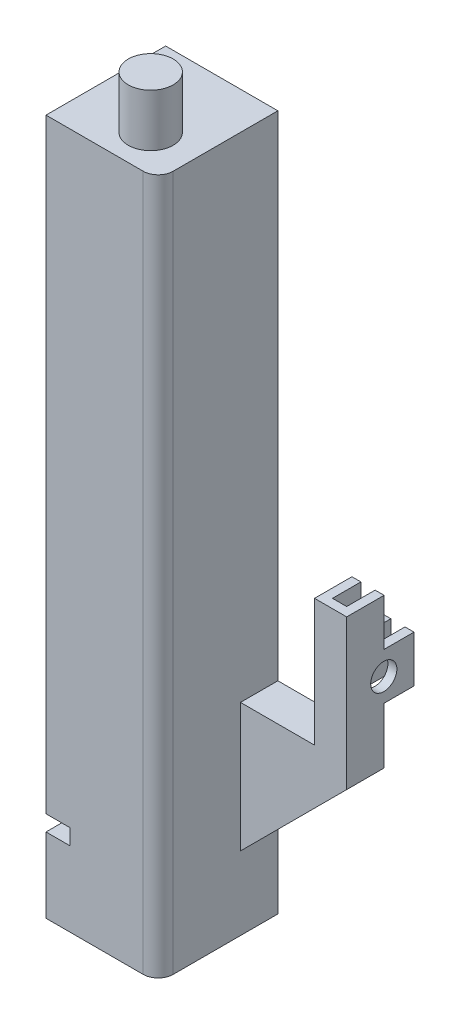
ISO-10303-21;
HEADER;
FILE_DESCRIPTION(('STEP AP214'),'2;1');
FILE_NAME('part.step','',(''),(''),'','','');
FILE_SCHEMA(('AUTOMOTIVE_DESIGN { 1 0 10303 214 1 1 1 1 }'));
ENDSEC;
DATA;
#1=APPLICATION_CONTEXT('core data for automotive mechanical design processes');
#2=APPLICATION_PROTOCOL_DEFINITION('international standard','automotive_design',2000,#1);
#3=PRODUCT_CONTEXT('',#1,'mechanical');
#4=PRODUCT('Part','Part','',(#3));
#5=PRODUCT_RELATED_PRODUCT_CATEGORY('part','',(#4));
#6=PRODUCT_DEFINITION_FORMATION('','',#4);
#7=PRODUCT_DEFINITION_CONTEXT('part definition',#1,'design');
#8=PRODUCT_DEFINITION('design','',#6,#7);
#9=PRODUCT_DEFINITION_SHAPE('','',#8);
#10=(LENGTH_UNIT() NAMED_UNIT(*) SI_UNIT(.MILLI.,.METRE.));
#11=(NAMED_UNIT(*) PLANE_ANGLE_UNIT() SI_UNIT($,.RADIAN.));
#12=(NAMED_UNIT(*) SI_UNIT($,.STERADIAN.) SOLID_ANGLE_UNIT());
#13=UNCERTAINTY_MEASURE_WITH_UNIT(LENGTH_MEASURE(1.E-05),#10,'distance_accuracy_value','');
#14=(GEOMETRIC_REPRESENTATION_CONTEXT(3) GLOBAL_UNCERTAINTY_ASSIGNED_CONTEXT((#13)) GLOBAL_UNIT_ASSIGNED_CONTEXT((#10,
#11,#12)) REPRESENTATION_CONTEXT('',''));
#15=CARTESIAN_POINT('',(0.,0.,0.));
#16=DIRECTION('',(0.,0.,1.));
#17=DIRECTION('',(1.,0.,0.));
#18=AXIS2_PLACEMENT_3D('',#15,#16,#17);
#19=CARTESIAN_POINT('',(-7.5,93.,7.5));
#20=DIRECTION('',(1.,0.,0.));
#21=DIRECTION('',(0.,0.,-1.));
#22=AXIS2_PLACEMENT_3D('',#19,#20,#21);
#23=PLANE('',#22);
#24=DIRECTION('',(0.,1.,0.));
#25=VECTOR('',#24,1.);
#26=CARTESIAN_POINT('',(-7.5,27.,-8.5));
#27=LINE('',#26,#25);
#28=CARTESIAN_POINT('',(-7.5,12.1,-8.5));
#29=VERTEX_POINT('',#28);
#30=CARTESIAN_POINT('',(-7.49999999999999,93.,-8.5));
#31=VERTEX_POINT('',#30);
#32=EDGE_CURVE('E294',#29,#31,#27,.T.);
#33=ORIENTED_EDGE('',*,*,#32,.F.);
#34=DIRECTION('',(0.,0.,1.));
#35=VECTOR('',#34,1.);
#36=CARTESIAN_POINT('',(-7.5,12.1,-12.5));
#37=LINE('',#36,#35);
#38=CARTESIAN_POINT('',(-7.5,12.1,7.5));
#39=VERTEX_POINT('',#38);
#40=EDGE_CURVE('E438',#29,#39,#37,.T.);
#41=ORIENTED_EDGE('',*,*,#40,.T.);
#42=DIRECTION('',(0.,-1.,0.));
#43=VECTOR('',#42,1.);
#44=CARTESIAN_POINT('',(-7.5,93.,7.5));
#45=LINE('',#44,#43);
#46=CARTESIAN_POINT('',(-7.5,93.,7.5));
#47=VERTEX_POINT('',#46);
#48=EDGE_CURVE('E243',#47,#39,#45,.T.);
#49=ORIENTED_EDGE('',*,*,#48,.F.);
#50=DIRECTION('',(0.,0.,1.));
#51=VECTOR('',#50,1.);
#52=CARTESIAN_POINT('',(-7.5,93.,7.5));
#53=LINE('',#52,#51);
#54=EDGE_CURVE('E248',#31,#47,#53,.T.);
#55=ORIENTED_EDGE('',*,*,#54,.F.);
#56=EDGE_LOOP('',(#33,#41,#49,#55));
#57=FACE_BOUND('',#56,.T.);
#58=ADVANCED_FACE('F35',(#57),#23,.F.);
#59=CARTESIAN_POINT('',(0.,27.,-8.5));
#60=DIRECTION('',(0.,-1.,0.));
#61=DIRECTION('',(1.,0.,0.));
#62=AXIS2_PLACEMENT_3D('',#59,#60,#61);
#63=PLANE('',#62);
#64=DIRECTION('',(1.,0.,0.));
#65=VECTOR('',#64,1.);
#66=CARTESIAN_POINT('',(0.,27.,-8.5));
#67=LINE('',#66,#65);
#68=CARTESIAN_POINT('',(7.5,27.,-8.5));
#69=VERTEX_POINT('',#68);
#70=CARTESIAN_POINT('',(17.4,27.,-8.5));
#71=VERTEX_POINT('',#70);
#72=EDGE_CURVE('E377',#69,#71,#67,.T.);
#73=ORIENTED_EDGE('',*,*,#72,.F.);
#74=DIRECTION('',(0.,0.,1.));
#75=VECTOR('',#74,1.);
#76=CARTESIAN_POINT('',(7.5,27.,-8.5));
#77=LINE('',#76,#75);
#78=CARTESIAN_POINT('',(7.5,27.,-3.5));
#79=VERTEX_POINT('',#78);
#80=EDGE_CURVE('E410',#69,#79,#77,.T.);
#81=ORIENTED_EDGE('',*,*,#80,.T.);
#82=DIRECTION('',(1.,0.,0.));
#83=VECTOR('',#82,1.);
#84=CARTESIAN_POINT('',(0.,27.,-3.5));
#85=LINE('',#84,#83);
#86=CARTESIAN_POINT('',(17.4,27.,-3.5));
#87=VERTEX_POINT('',#86);
#88=EDGE_CURVE('E364',#79,#87,#85,.T.);
#89=ORIENTED_EDGE('',*,*,#88,.T.);
#90=DIRECTION('',(0.,0.,1.));
#91=VECTOR('',#90,1.);
#92=CARTESIAN_POINT('',(17.4,27.,-8.5));
#93=LINE('',#92,#91);
#94=EDGE_CURVE('E408',#71,#87,#93,.T.);
#95=ORIENTED_EDGE('',*,*,#94,.F.);
#96=EDGE_LOOP('',(#73,#81,#89,#95));
#97=FACE_BOUND('',#96,.T.);
#98=ADVANCED_FACE('F477',(#97),#63,.F.);
#99=CARTESIAN_POINT('',(0.,0.,-8.5));
#100=DIRECTION('',(0.,0.,-1.));
#101=DIRECTION('',(-1.,0.,0.));
#102=AXIS2_PLACEMENT_3D('',#99,#100,#101);
#103=PLANE('',#102);
#104=DIRECTION('',(0.,-1.,0.));
#105=VECTOR('',#104,1.);
#106=CARTESIAN_POINT('',(20.5000000000001,0.,-8.5));
#107=LINE('',#106,#105);
#108=CARTESIAN_POINT('',(20.5000000000001,44.,-8.5));
#109=VERTEX_POINT('',#108);
#110=CARTESIAN_POINT('',(20.5000000000001,37.74,-8.5));
#111=VERTEX_POINT('',#110);
#112=EDGE_CURVE('E319',#109,#111,#107,.T.);
#113=ORIENTED_EDGE('',*,*,#112,.F.);
#114=DIRECTION('',(-1.,0.,0.));
#115=VECTOR('',#114,1.);
#116=CARTESIAN_POINT('',(0.,44.,-8.5));
#117=LINE('',#116,#115);
#118=CARTESIAN_POINT('',(21.7,44.,-8.5));
#119=VERTEX_POINT('',#118);
#120=EDGE_CURVE('E385',#119,#109,#117,.T.);
#121=ORIENTED_EDGE('',*,*,#120,.F.);
#122=DIRECTION('',(0.,-1.,0.));
#123=VECTOR('',#122,1.);
#124=CARTESIAN_POINT('',(21.7,0.,-8.5));
#125=LINE('',#124,#123);
#126=CARTESIAN_POINT('',(21.7,37.74,-8.5));
#127=VERTEX_POINT('',#126);
#128=EDGE_CURVE('E374',#119,#127,#125,.T.);
#129=ORIENTED_EDGE('',*,*,#128,.T.);
#130=DIRECTION('',(1.,0.,0.));
#131=VECTOR('',#130,1.);
#132=CARTESIAN_POINT('',(0.,37.74,-8.5));
#133=LINE('',#132,#131);
#134=EDGE_CURVE('E268',#111,#127,#133,.T.);
#135=ORIENTED_EDGE('',*,*,#134,.F.);
#136=EDGE_LOOP('',(#113,#121,#129,#135));
#137=FACE_BOUND('',#136,.T.);
#138=ADVANCED_FACE('F524',(#137),#103,.T.);
#139=CARTESIAN_POINT('',(3.07345121810559,31.5,-12.5));
#140=DIRECTION('',(0.,-1.,0.));
#141=DIRECTION('',(0.,0.,-1.));
#142=AXIS2_PLACEMENT_3D('',#139,#140,#141);
#143=PLANE('',#142);
#144=DIRECTION('',(0.,0.,1.));
#145=VECTOR('',#144,1.);
#146=CARTESIAN_POINT('',(20.5000000000001,31.5,-12.5));
#147=LINE('',#146,#145);
#148=CARTESIAN_POINT('',(20.5000000000001,31.5,-12.5));
#149=VERTEX_POINT('',#148);
#150=CARTESIAN_POINT('',(20.5000000000001,31.5,-8.5));
#151=VERTEX_POINT('',#150);
#152=EDGE_CURVE('E317',#149,#151,#147,.T.);
#153=ORIENTED_EDGE('',*,*,#152,.F.);
#154=DIRECTION('',(1.,0.,0.));
#155=VECTOR('',#154,1.);
#156=CARTESIAN_POINT('',(3.07345121810559,31.5,-12.5));
#157=LINE('',#156,#155);
#158=CARTESIAN_POINT('',(21.7,31.5,-12.5));
#159=VERTEX_POINT('',#158);
#160=EDGE_CURVE('E333',#149,#159,#157,.T.);
#161=ORIENTED_EDGE('',*,*,#160,.T.);
#162=DIRECTION('',(0.,0.,-1.));
#163=VECTOR('',#162,1.);
#164=CARTESIAN_POINT('',(21.7,31.5,-12.5));
#165=LINE('',#164,#163);
#166=CARTESIAN_POINT('',(21.7,31.5,-8.5));
#167=VERTEX_POINT('',#166);
#168=EDGE_CURVE('E321',#167,#159,#165,.T.);
#169=ORIENTED_EDGE('',*,*,#168,.F.);
#170=DIRECTION('',(-1.,0.,0.));
#171=VECTOR('',#170,1.);
#172=CARTESIAN_POINT('',(0.,31.5,-8.5));
#173=LINE('',#172,#171);
#174=EDGE_CURVE('E265',#167,#151,#173,.T.);
#175=ORIENTED_EDGE('',*,*,#174,.T.);
#176=EDGE_LOOP('',(#153,#161,#169,#175));
#177=FACE_BOUND('',#176,.T.);
#178=ADVANCED_FACE('F510',(#177),#143,.T.);
#179=CARTESIAN_POINT('',(3.07345121810559,37.74,-12.5));
#180=DIRECTION('',(0.,0.,-1.));
#181=DIRECTION('',(0.,1.,0.));
#182=AXIS2_PLACEMENT_3D('',#179,#180,#181);
#183=PLANE('',#182);
#184=DIRECTION('',(0.,-1.,0.));
#185=VECTOR('',#184,1.);
#186=CARTESIAN_POINT('',(20.5000000000001,37.74,-12.5));
#187=LINE('',#186,#185);
#188=CARTESIAN_POINT('',(20.5000000000001,37.74,-12.5));
#189=VERTEX_POINT('',#188);
#190=EDGE_CURVE('E315',#189,#149,#187,.T.);
#191=ORIENTED_EDGE('',*,*,#190,.F.);
#192=DIRECTION('',(1.,0.,0.));
#193=VECTOR('',#192,1.);
#194=CARTESIAN_POINT('',(3.07345121810559,37.74,-12.5));
#195=LINE('',#194,#193);
#196=CARTESIAN_POINT('',(21.7,37.74,-12.5));
#197=VERTEX_POINT('',#196);
#198=EDGE_CURVE('E342',#189,#197,#195,.T.);
#199=ORIENTED_EDGE('',*,*,#198,.T.);
#200=DIRECTION('',(0.,1.,0.));
#201=VECTOR('',#200,1.);
#202=CARTESIAN_POINT('',(21.7,37.74,-12.5));
#203=LINE('',#202,#201);
#204=EDGE_CURVE('E326',#159,#197,#203,.T.);
#205=ORIENTED_EDGE('',*,*,#204,.F.);
#206=ORIENTED_EDGE('',*,*,#160,.F.);
#207=EDGE_LOOP('',(#191,#199,#205,#206));
#208=FACE_BOUND('',#207,.T.);
#209=ADVANCED_FACE('F516',(#208),#183,.T.);
#210=CARTESIAN_POINT('',(3.07345121810559,37.74,-8.5));
#211=DIRECTION('',(0.,1.,0.));
#212=DIRECTION('',(0.,0.,1.));
#213=AXIS2_PLACEMENT_3D('',#210,#211,#212);
#214=PLANE('',#213);
#215=DIRECTION('',(0.,0.,-1.));
#216=VECTOR('',#215,1.);
#217=CARTESIAN_POINT('',(20.5000000000001,37.74,-8.5));
#218=LINE('',#217,#216);
#219=EDGE_CURVE('E274',#111,#189,#218,.T.);
#220=ORIENTED_EDGE('',*,*,#219,.F.);
#221=ORIENTED_EDGE('',*,*,#134,.T.);
#222=DIRECTION('',(0.,0.,1.));
#223=VECTOR('',#222,1.);
#224=CARTESIAN_POINT('',(21.7,37.74,-8.5));
#225=LINE('',#224,#223);
#226=EDGE_CURVE('E322',#197,#127,#225,.T.);
#227=ORIENTED_EDGE('',*,*,#226,.F.);
#228=ORIENTED_EDGE('',*,*,#198,.F.);
#229=EDGE_LOOP('',(#220,#221,#227,#228));
#230=FACE_BOUND('',#229,.T.);
#231=ADVANCED_FACE('F520',(#230),#214,.T.);
#232=DIRECTION('',(0.,1.,0.));
#233=VECTOR('',#232,1.);
#234=CARTESIAN_POINT('',(18.6000000000001,0.,-8.5));
#235=LINE('',#234,#233);
#236=CARTESIAN_POINT('',(18.6000000000001,37.74,-8.5));
#237=VERTEX_POINT('',#236);
#238=CARTESIAN_POINT('',(18.6000000000001,44.,-8.5));
#239=VERTEX_POINT('',#238);
#240=EDGE_CURVE('E312',#237,#239,#235,.T.);
#241=ORIENTED_EDGE('',*,*,#240,.F.);
#242=CARTESIAN_POINT('',(17.4,37.74,-8.5));
#243=VERTEX_POINT('',#242);
#244=EDGE_CURVE('E269',#243,#237,#133,.T.);
#245=ORIENTED_EDGE('',*,*,#244,.F.);
#246=DIRECTION('',(0.,-1.,0.));
#247=VECTOR('',#246,1.);
#248=CARTESIAN_POINT('',(17.4,0.,-8.5));
#249=LINE('',#248,#247);
#250=CARTESIAN_POINT('',(17.4,44.,-8.5));
#251=VERTEX_POINT('',#250);
#252=EDGE_CURVE('E381',#251,#243,#249,.T.);
#253=ORIENTED_EDGE('',*,*,#252,.F.);
#254=EDGE_CURVE('E384',#239,#251,#117,.T.);
#255=ORIENTED_EDGE('',*,*,#254,.F.);
#256=EDGE_LOOP('',(#241,#245,#253,#255));
#257=FACE_BOUND('',#256,.T.);
#258=ADVANCED_FACE('F495',(#257),#103,.T.);
#259=CARTESIAN_POINT('',(7.5,93.,7.5));
#260=DIRECTION('',(-1.,0.,0.));
#261=DIRECTION('',(0.,0.,1.));
#262=AXIS2_PLACEMENT_3D('',#259,#260,#261);
#263=PLANE('',#262);
#264=DIRECTION('',(0.,0.,1.));
#265=VECTOR('',#264,1.);
#266=CARTESIAN_POINT('',(7.5,9.79999999999985,-28.5818325856981));
#267=LINE('',#266,#265);
#268=CARTESIAN_POINT('',(7.50000000000001,9.79999999999988,-8.5));
#269=VERTEX_POINT('',#268);
#270=CARTESIAN_POINT('',(7.5,9.79999999999985,-3.5));
#271=VERTEX_POINT('',#270);
#272=EDGE_CURVE('E447',#269,#271,#267,.T.);
#273=ORIENTED_EDGE('',*,*,#272,.T.);
#274=DIRECTION('',(0.,-1.,0.));
#275=VECTOR('',#274,1.);
#276=CARTESIAN_POINT('',(7.5,0.,-3.5));
#277=LINE('',#276,#275);
#278=EDGE_CURVE('E50',#79,#271,#277,.T.);
#279=ORIENTED_EDGE('',*,*,#278,.F.);
#280=ORIENTED_EDGE('',*,*,#80,.F.);
#281=DIRECTION('',(0.,-1.,0.));
#282=VECTOR('',#281,1.);
#283=CARTESIAN_POINT('',(7.50000000000001,108.033296378373,-8.5));
#284=LINE('',#283,#282);
#285=CARTESIAN_POINT('',(7.50000000000001,93.,-8.5));
#286=VERTEX_POINT('',#285);
#287=EDGE_CURVE('E300',#286,#69,#284,.T.);
#288=ORIENTED_EDGE('',*,*,#287,.F.);
#289=DIRECTION('',(0.,0.,-1.));
#290=VECTOR('',#289,1.);
#291=CARTESIAN_POINT('',(7.5,93.,7.5));
#292=LINE('',#291,#290);
#293=CARTESIAN_POINT('',(7.5,93.,5.5));
#294=VERTEX_POINT('',#293);
#295=EDGE_CURVE('E419',#294,#286,#292,.T.);
#296=ORIENTED_EDGE('',*,*,#295,.F.);
#297=DIRECTION('',(0.,-1.,0.));
#298=VECTOR('',#297,1.);
#299=CARTESIAN_POINT('',(7.5,93.,5.5));
#300=LINE('',#299,#298);
#301=CARTESIAN_POINT('',(7.5,0.,5.5));
#302=VERTEX_POINT('',#301);
#303=EDGE_CURVE('E256',#294,#302,#300,.T.);
#304=ORIENTED_EDGE('',*,*,#303,.T.);
#305=DIRECTION('',(0.,0.,-1.));
#306=VECTOR('',#305,1.);
#307=CARTESIAN_POINT('',(7.5,0.,7.5));
#308=LINE('',#307,#306);
#309=CARTESIAN_POINT('',(7.5,0.,-8.5));
#310=VERTEX_POINT('',#309);
#311=EDGE_CURVE('E418',#302,#310,#308,.T.);
#312=ORIENTED_EDGE('',*,*,#311,.T.);
#313=EDGE_CURVE('E57',#269,#310,#284,.T.);
#314=ORIENTED_EDGE('',*,*,#313,.F.);
#315=EDGE_LOOP('',(#273,#279,#280,#288,#296,#304,#312,#314));
#316=FACE_BOUND('',#315,.T.);
#317=ADVANCED_FACE('F434',(#316),#263,.F.);
#318=CARTESIAN_POINT('',(-7.5,10.,7.5));
#319=VERTEX_POINT('',#318);
#320=CARTESIAN_POINT('',(-7.5,0.,7.5));
#321=VERTEX_POINT('',#320);
#322=EDGE_CURVE('E233',#319,#321,#45,.T.);
#323=ORIENTED_EDGE('',*,*,#322,.F.);
#324=DIRECTION('',(0.,0.,1.));
#325=VECTOR('',#324,1.);
#326=CARTESIAN_POINT('',(-7.5,10.,-12.5));
#327=LINE('',#326,#325);
#328=CARTESIAN_POINT('',(-7.5,10.,-8.5));
#329=VERTEX_POINT('',#328);
#330=EDGE_CURVE('E215',#329,#319,#327,.T.);
#331=ORIENTED_EDGE('',*,*,#330,.F.);
#332=CARTESIAN_POINT('',(-7.5,0.,-8.5));
#333=VERTEX_POINT('',#332);
#334=EDGE_CURVE('E291',#333,#329,#27,.T.);
#335=ORIENTED_EDGE('',*,*,#334,.F.);
#336=DIRECTION('',(0.,0.,1.));
#337=VECTOR('',#336,1.);
#338=CARTESIAN_POINT('',(-7.5,0.,7.5));
#339=LINE('',#338,#337);
#340=EDGE_CURVE('E241',#333,#321,#339,.T.);
#341=ORIENTED_EDGE('',*,*,#340,.T.);
#342=EDGE_LOOP('',(#323,#331,#335,#341));
#343=FACE_BOUND('',#342,.T.);
#344=ADVANCED_FACE('F240',(#343),#23,.F.);
#345=CARTESIAN_POINT('',(-7.5,93.,7.5));
#346=DIRECTION('',(0.,0.,-1.));
#347=DIRECTION('',(-1.,0.,0.));
#348=AXIS2_PLACEMENT_3D('',#345,#346,#347);
#349=PLANE('',#348);
#350=ORIENTED_EDGE('',*,*,#48,.T.);
#351=DIRECTION('',(-1.,0.,0.));
#352=VECTOR('',#351,1.);
#353=CARTESIAN_POINT('',(-7.5,12.1,7.5));
#354=LINE('',#353,#352);
#355=CARTESIAN_POINT('',(-4.30000000000001,12.1,7.5));
#356=VERTEX_POINT('',#355);
#357=EDGE_CURVE('E227',#356,#39,#354,.T.);
#358=ORIENTED_EDGE('',*,*,#357,.F.);
#359=DIRECTION('',(0.,1.,0.));
#360=VECTOR('',#359,1.);
#361=CARTESIAN_POINT('',(-4.30000000000001,12.1,7.5));
#362=LINE('',#361,#360);
#363=CARTESIAN_POINT('',(-4.3,10.,7.5));
#364=VERTEX_POINT('',#363);
#365=EDGE_CURVE('E237',#364,#356,#362,.T.);
#366=ORIENTED_EDGE('',*,*,#365,.F.);
#367=DIRECTION('',(1.,0.,0.));
#368=VECTOR('',#367,1.);
#369=CARTESIAN_POINT('',(-4.3,10.,7.5));
#370=LINE('',#369,#368);
#371=EDGE_CURVE('E218',#319,#364,#370,.T.);
#372=ORIENTED_EDGE('',*,*,#371,.F.);
#373=ORIENTED_EDGE('',*,*,#322,.T.);
#374=DIRECTION('',(1.,0.,0.));
#375=VECTOR('',#374,1.);
#376=CARTESIAN_POINT('',(-7.5,0.,7.5));
#377=LINE('',#376,#375);
#378=CARTESIAN_POINT('',(5.49999999999999,0.,7.5));
#379=VERTEX_POINT('',#378);
#380=EDGE_CURVE('E252',#321,#379,#377,.T.);
#381=ORIENTED_EDGE('',*,*,#380,.T.);
#382=DIRECTION('',(0.,-1.,0.));
#383=VECTOR('',#382,1.);
#384=CARTESIAN_POINT('',(5.5,93.,7.5));
#385=LINE('',#384,#383);
#386=CARTESIAN_POINT('',(5.49999999999999,93.,7.5));
#387=VERTEX_POINT('',#386);
#388=EDGE_CURVE('E261',#379,#387,#385,.F.);
#389=ORIENTED_EDGE('',*,*,#388,.T.);
#390=DIRECTION('',(1.,0.,0.));
#391=VECTOR('',#390,1.);
#392=CARTESIAN_POINT('',(-7.5,93.,7.5));
#393=LINE('',#392,#391);
#394=EDGE_CURVE('E244',#47,#387,#393,.T.);
#395=ORIENTED_EDGE('',*,*,#394,.F.);
#396=EDGE_LOOP('',(#350,#358,#366,#372,#373,#381,#389,#395));
#397=FACE_BOUND('',#396,.T.);
#398=ADVANCED_FACE('F231',(#397),#349,.F.);
#399=CARTESIAN_POINT('',(0.,93.,0.));
#400=DIRECTION('',(0.,-1.,0.));
#401=DIRECTION('',(0.,0.,-1.));
#402=AXIS2_PLACEMENT_3D('',#399,#400,#401);
#403=PLANE('',#402);
#404=CARTESIAN_POINT('',(1.5,93.,2.5));
#405=DIRECTION('',(0.,-1.,0.));
#406=DIRECTION('',(0.,0.,-1.));
#407=AXIS2_PLACEMENT_3D('',#404,#405,#406);
#408=CIRCLE('',#407,3.);
#409=CARTESIAN_POINT('',(1.5,93.,-0.5));
#410=VERTEX_POINT('',#409);
#411=EDGE_CURVE('E246',#410,#410,#408,.F.);
#412=ORIENTED_EDGE('',*,*,#411,.F.);
#413=EDGE_LOOP('',(#412));
#414=FACE_BOUND('',#413,.T.);
#415=ORIENTED_EDGE('',*,*,#394,.T.);
#416=CARTESIAN_POINT('',(5.5,93.,5.5));
#417=DIRECTION('',(0.,-1.,0.));
#418=DIRECTION('',(0.,0.,-1.));
#419=AXIS2_PLACEMENT_3D('',#416,#417,#418);
#420=CIRCLE('',#419,2.);
#421=EDGE_CURVE('E263',#387,#294,#420,.F.);
#422=ORIENTED_EDGE('',*,*,#421,.T.);
#423=ORIENTED_EDGE('',*,*,#295,.T.);
#424=DIRECTION('',(1.,0.,0.));
#425=VECTOR('',#424,1.);
#426=CARTESIAN_POINT('',(7.50000000000001,93.,-8.5));
#427=LINE('',#426,#425);
#428=EDGE_CURVE('E298',#31,#286,#427,.T.);
#429=ORIENTED_EDGE('',*,*,#428,.F.);
#430=ORIENTED_EDGE('',*,*,#54,.T.);
#431=EDGE_LOOP('',(#415,#422,#423,#429,#430));
#432=FACE_BOUND('',#431,.T.);
#433=ADVANCED_FACE('F430',(#414,#432),#403,.F.);
#434=CARTESIAN_POINT('',(0.,0.,0.));
#435=DIRECTION('',(0.,-1.,0.));
#436=DIRECTION('',(0.,0.,-1.));
#437=AXIS2_PLACEMENT_3D('',#434,#435,#436);
#438=PLANE('',#437);
#439=ORIENTED_EDGE('',*,*,#311,.F.);
#440=CARTESIAN_POINT('',(5.5,0.,5.5));
#441=DIRECTION('',(0.,-1.,0.));
#442=DIRECTION('',(0.,0.,-1.));
#443=AXIS2_PLACEMENT_3D('',#440,#441,#442);
#444=CIRCLE('',#443,2.);
#445=EDGE_CURVE('E259',#302,#379,#444,.T.);
#446=ORIENTED_EDGE('',*,*,#445,.T.);
#447=ORIENTED_EDGE('',*,*,#380,.F.);
#448=ORIENTED_EDGE('',*,*,#340,.F.);
#449=DIRECTION('',(-1.,0.,0.));
#450=VECTOR('',#449,1.);
#451=CARTESIAN_POINT('',(7.5,0.,-8.5));
#452=LINE('',#451,#450);
#453=EDGE_CURVE('E293',#310,#333,#452,.T.);
#454=ORIENTED_EDGE('',*,*,#453,.F.);
#455=EDGE_LOOP('',(#439,#446,#447,#448,#454));
#456=FACE_BOUND('',#455,.T.);
#457=ADVANCED_FACE('F632',(#456),#438,.T.);
#458=CARTESIAN_POINT('',(1.5,100.,2.5));
#459=DIRECTION('',(0.,-1.,0.));
#460=DIRECTION('',(0.,0.,-1.));
#461=AXIS2_PLACEMENT_3D('',#458,#459,#460);
#462=CYLINDRICAL_SURFACE('',#461,3.);
#463=CARTESIAN_POINT('',(1.5,100.,2.5));
#464=DIRECTION('',(0.,1.,0.));
#465=DIRECTION('',(0.,0.,1.));
#466=AXIS2_PLACEMENT_3D('',#463,#464,#465);
#467=CIRCLE('',#466,3.);
#468=CARTESIAN_POINT('',(1.5,100.,5.5));
#469=VERTEX_POINT('',#468);
#470=EDGE_CURVE('E415',#469,#469,#467,.T.);
#471=ORIENTED_EDGE('',*,*,#470,.F.);
#472=EDGE_LOOP('',(#471));
#473=FACE_BOUND('',#472,.T.);
#474=ORIENTED_EDGE('',*,*,#411,.T.);
#475=EDGE_LOOP('',(#474));
#476=FACE_BOUND('',#475,.T.);
#477=ADVANCED_FACE('F623',(#473,#476),#462,.T.);
#478=CARTESIAN_POINT('',(1.5,100.,2.5));
#479=DIRECTION('',(0.,1.,0.));
#480=DIRECTION('',(0.,0.,1.));
#481=AXIS2_PLACEMENT_3D('',#478,#479,#480);
#482=PLANE('',#481);
#483=ORIENTED_EDGE('',*,*,#470,.T.);
#484=EDGE_LOOP('',(#483));
#485=FACE_BOUND('',#484,.T.);
#486=ADVANCED_FACE('F613',(#485),#482,.T.);
#487=CARTESIAN_POINT('',(5.5,93.,5.5));
#488=DIRECTION('',(0.,-1.,0.));
#489=DIRECTION('',(0.,0.,-1.));
#490=AXIS2_PLACEMENT_3D('',#487,#488,#489);
#491=CYLINDRICAL_SURFACE('',#490,2.);
#492=ORIENTED_EDGE('',*,*,#421,.F.);
#493=ORIENTED_EDGE('',*,*,#388,.F.);
#494=ORIENTED_EDGE('',*,*,#445,.F.);
#495=ORIENTED_EDGE('',*,*,#303,.F.);
#496=EDGE_LOOP('',(#492,#493,#494,#495));
#497=FACE_BOUND('',#496,.T.);
#498=ADVANCED_FACE('F37',(#497),#491,.T.);
#499=CARTESIAN_POINT('',(21.7,0.,-8.5));
#500=DIRECTION('',(-1.,0.,0.));
#501=DIRECTION('',(0.,-1.,0.));
#502=AXIS2_PLACEMENT_3D('',#499,#500,#501);
#503=PLANE('',#502);
#504=CARTESIAN_POINT('',(21.7,34.62,-8.46));
#505=DIRECTION('',(1.,0.,0.));
#506=DIRECTION('',(0.,1.,0.));
#507=AXIS2_PLACEMENT_3D('',#504,#505,#506);
#508=CIRCLE('',#507,1.75);
#509=CARTESIAN_POINT('',(21.7,36.37,-8.46));
#510=VERTEX_POINT('',#509);
#511=EDGE_CURVE('E280',#510,#510,#508,.T.);
#512=ORIENTED_EDGE('',*,*,#511,.F.);
#513=EDGE_LOOP('',(#512));
#514=FACE_BOUND('',#513,.T.);
#515=DIRECTION('',(0.,0.,1.));
#516=VECTOR('',#515,1.);
#517=CARTESIAN_POINT('',(21.7,44.,-8.5));
#518=LINE('',#517,#516);
#519=CARTESIAN_POINT('',(21.7,44.,-3.5));
#520=VERTEX_POINT('',#519);
#521=EDGE_CURVE('E394',#119,#520,#518,.T.);
#522=ORIENTED_EDGE('',*,*,#521,.T.);
#523=DIRECTION('',(0.,-1.,0.));
#524=VECTOR('',#523,1.);
#525=CARTESIAN_POINT('',(21.7,0.,-3.5));
#526=LINE('',#525,#524);
#527=CARTESIAN_POINT('',(21.7,24.,-3.5));
#528=VERTEX_POINT('',#527);
#529=EDGE_CURVE('E361',#520,#528,#526,.T.);
#530=ORIENTED_EDGE('',*,*,#529,.T.);
#531=DIRECTION('',(0.,0.,1.));
#532=VECTOR('',#531,1.);
#533=CARTESIAN_POINT('',(21.7,24.,-8.5));
#534=LINE('',#533,#532);
#535=CARTESIAN_POINT('',(21.7,24.,-8.5));
#536=VERTEX_POINT('',#535);
#537=EDGE_CURVE('E412',#536,#528,#534,.T.);
#538=ORIENTED_EDGE('',*,*,#537,.F.);
#539=EDGE_CURVE('E373',#167,#536,#125,.T.);
#540=ORIENTED_EDGE('',*,*,#539,.F.);
#541=ORIENTED_EDGE('',*,*,#168,.T.);
#542=ORIENTED_EDGE('',*,*,#204,.T.);
#543=ORIENTED_EDGE('',*,*,#226,.T.);
#544=ORIENTED_EDGE('',*,*,#128,.F.);
#545=EDGE_LOOP('',(#522,#530,#538,#540,#541,#542,#543,#544));
#546=FACE_BOUND('',#545,.T.);
#547=ADVANCED_FACE('F462',(#514,#546),#503,.F.);
#548=CARTESIAN_POINT('',(17.4,0.,-8.5));
#549=DIRECTION('',(-1.,0.,0.));
#550=DIRECTION('',(0.,-1.,0.));
#551=AXIS2_PLACEMENT_3D('',#548,#549,#550);
#552=PLANE('',#551);
#553=CARTESIAN_POINT('',(17.4,34.62,-8.46));
#554=DIRECTION('',(-1.,0.,0.));
#555=DIRECTION('',(0.,-1.,0.));
#556=AXIS2_PLACEMENT_3D('',#553,#554,#555);
#557=CIRCLE('',#556,1.75);
#558=CARTESIAN_POINT('',(17.4,32.87,-8.46));
#559=VERTEX_POINT('',#558);
#560=EDGE_CURVE('E305',#559,#559,#557,.T.);
#561=ORIENTED_EDGE('',*,*,#560,.F.);
#562=EDGE_LOOP('',(#561));
#563=FACE_BOUND('',#562,.T.);
#564=DIRECTION('',(0.,-1.,0.));
#565=VECTOR('',#564,1.);
#566=CARTESIAN_POINT('',(17.4,0.,-3.5));
#567=LINE('',#566,#565);
#568=CARTESIAN_POINT('',(17.4,44.,-3.5));
#569=VERTEX_POINT('',#568);
#570=EDGE_CURVE('E367',#569,#87,#567,.T.);
#571=ORIENTED_EDGE('',*,*,#570,.F.);
#572=DIRECTION('',(0.,0.,1.));
#573=VECTOR('',#572,1.);
#574=CARTESIAN_POINT('',(17.4,44.,-8.5));
#575=LINE('',#574,#573);
#576=EDGE_CURVE('E406',#251,#569,#575,.T.);
#577=ORIENTED_EDGE('',*,*,#576,.F.);
#578=ORIENTED_EDGE('',*,*,#252,.T.);
#579=DIRECTION('',(0.,0.,1.));
#580=VECTOR('',#579,1.);
#581=CARTESIAN_POINT('',(17.4,37.74,-8.5));
#582=LINE('',#581,#580);
#583=CARTESIAN_POINT('',(17.4,37.74,-12.5));
#584=VERTEX_POINT('',#583);
#585=EDGE_CURVE('E334',#584,#243,#582,.T.);
#586=ORIENTED_EDGE('',*,*,#585,.F.);
#587=DIRECTION('',(0.,1.,0.));
#588=VECTOR('',#587,1.);
#589=CARTESIAN_POINT('',(17.4,37.74,-12.5));
#590=LINE('',#589,#588);
#591=CARTESIAN_POINT('',(17.4,31.5,-12.5));
#592=VERTEX_POINT('',#591);
#593=EDGE_CURVE('E339',#592,#584,#590,.T.);
#594=ORIENTED_EDGE('',*,*,#593,.F.);
#595=DIRECTION('',(0.,0.,-1.));
#596=VECTOR('',#595,1.);
#597=CARTESIAN_POINT('',(17.4,31.5,-12.5));
#598=LINE('',#597,#596);
#599=CARTESIAN_POINT('',(17.4,31.5,-8.5));
#600=VERTEX_POINT('',#599);
#601=EDGE_CURVE('E325',#600,#592,#598,.T.);
#602=ORIENTED_EDGE('',*,*,#601,.F.);
#603=EDGE_CURVE('E379',#600,#71,#249,.T.);
#604=ORIENTED_EDGE('',*,*,#603,.T.);
#605=ORIENTED_EDGE('',*,*,#94,.T.);
#606=EDGE_LOOP('',(#571,#577,#578,#586,#594,#602,#604,#605));
#607=FACE_BOUND('',#606,.T.);
#608=ADVANCED_FACE('F471',(#563,#607),#552,.T.);
#609=CARTESIAN_POINT('',(0.,44.,-8.5));
#610=DIRECTION('',(0.,1.,0.));
#611=DIRECTION('',(0.,0.,1.));
#612=AXIS2_PLACEMENT_3D('',#609,#610,#611);
#613=PLANE('',#612);
#614=ORIENTED_EDGE('',*,*,#120,.T.);
#615=DIRECTION('',(0.,0.,1.));
#616=VECTOR('',#615,1.);
#617=CARTESIAN_POINT('',(20.5,44.,-8.5));
#618=LINE('',#617,#616);
#619=CARTESIAN_POINT('',(20.5,44.,-4.7));
#620=VERTEX_POINT('',#619);
#621=EDGE_CURVE('E396',#109,#620,#618,.T.);
#622=ORIENTED_EDGE('',*,*,#621,.T.);
#623=DIRECTION('',(-1.,0.,0.));
#624=VECTOR('',#623,1.);
#625=CARTESIAN_POINT('',(17.4,44.,-4.7));
#626=LINE('',#625,#624);
#627=CARTESIAN_POINT('',(18.6,44.,-4.7));
#628=VERTEX_POINT('',#627);
#629=EDGE_CURVE('E350',#620,#628,#626,.T.);
#630=ORIENTED_EDGE('',*,*,#629,.T.);
#631=DIRECTION('',(0.,0.,1.));
#632=VECTOR('',#631,1.);
#633=CARTESIAN_POINT('',(18.6,44.,-8.5));
#634=LINE('',#633,#632);
#635=EDGE_CURVE('E404',#239,#628,#634,.T.);
#636=ORIENTED_EDGE('',*,*,#635,.F.);
#637=ORIENTED_EDGE('',*,*,#254,.T.);
#638=ORIENTED_EDGE('',*,*,#576,.T.);
#639=DIRECTION('',(1.,0.,0.));
#640=VECTOR('',#639,1.);
#641=CARTESIAN_POINT('',(0.,44.,-3.5));
#642=LINE('',#641,#640);
#643=EDGE_CURVE('E370',#569,#520,#642,.T.);
#644=ORIENTED_EDGE('',*,*,#643,.T.);
#645=ORIENTED_EDGE('',*,*,#521,.F.);
#646=EDGE_LOOP('',(#614,#622,#630,#636,#637,#638,#644,#645));
#647=FACE_BOUND('',#646,.T.);
#648=ADVANCED_FACE('F467',(#647),#613,.T.);
#649=CARTESIAN_POINT('',(18.6,0.,-8.5));
#650=DIRECTION('',(1.,0.,0.));
#651=DIRECTION('',(0.,0.,-1.));
#652=AXIS2_PLACEMENT_3D('',#649,#650,#651);
#653=PLANE('',#652);
#654=CARTESIAN_POINT('',(18.6,34.62,-8.46));
#655=DIRECTION('',(1.,0.,0.));
#656=DIRECTION('',(0.,0.,-1.));
#657=AXIS2_PLACEMENT_3D('',#654,#655,#656);
#658=CIRCLE('',#657,1.75);
#659=CARTESIAN_POINT('',(18.6,34.62,-10.21));
#660=VERTEX_POINT('',#659);
#661=EDGE_CURVE('E279',#660,#660,#658,.T.);
#662=ORIENTED_EDGE('',*,*,#661,.F.);
#663=EDGE_LOOP('',(#662));
#664=FACE_BOUND('',#663,.T.);
#665=ORIENTED_EDGE('',*,*,#240,.T.);
#666=ORIENTED_EDGE('',*,*,#635,.T.);
#667=DIRECTION('',(0.,1.,0.));
#668=VECTOR('',#667,1.);
#669=CARTESIAN_POINT('',(18.6,0.,-4.7));
#670=LINE('',#669,#668);
#671=CARTESIAN_POINT('',(18.6,27.,-4.7));
#672=VERTEX_POINT('',#671);
#673=EDGE_CURVE('E358',#672,#628,#670,.T.);
#674=ORIENTED_EDGE('',*,*,#673,.F.);
#675=DIRECTION('',(0.,0.,1.));
#676=VECTOR('',#675,1.);
#677=CARTESIAN_POINT('',(18.6,27.,-8.5));
#678=LINE('',#677,#676);
#679=CARTESIAN_POINT('',(18.6,27.,-8.5));
#680=VERTEX_POINT('',#679);
#681=EDGE_CURVE('E401',#680,#672,#678,.T.);
#682=ORIENTED_EDGE('',*,*,#681,.F.);
#683=DIRECTION('',(0.,1.,0.));
#684=VECTOR('',#683,1.);
#685=CARTESIAN_POINT('',(18.6,0.,-8.5));
#686=LINE('',#685,#684);
#687=CARTESIAN_POINT('',(18.6000000000001,31.5,-8.5));
#688=VERTEX_POINT('',#687);
#689=EDGE_CURVE('E388',#680,#688,#686,.T.);
#690=ORIENTED_EDGE('',*,*,#689,.T.);
#691=DIRECTION('',(0.,0.,-1.));
#692=VECTOR('',#691,1.);
#693=CARTESIAN_POINT('',(18.6000000000001,31.5,-12.5));
#694=LINE('',#693,#692);
#695=CARTESIAN_POINT('',(18.6000000000001,31.5,-12.5));
#696=VERTEX_POINT('',#695);
#697=EDGE_CURVE('E310',#688,#696,#694,.T.);
#698=ORIENTED_EDGE('',*,*,#697,.T.);
#699=DIRECTION('',(0.,1.,0.));
#700=VECTOR('',#699,1.);
#701=CARTESIAN_POINT('',(18.6000000000001,37.74,-12.5));
#702=LINE('',#701,#700);
#703=CARTESIAN_POINT('',(18.6000000000001,37.74,-12.5));
#704=VERTEX_POINT('',#703);
#705=EDGE_CURVE('E308',#696,#704,#702,.T.);
#706=ORIENTED_EDGE('',*,*,#705,.T.);
#707=DIRECTION('',(0.,0.,1.));
#708=VECTOR('',#707,1.);
#709=CARTESIAN_POINT('',(18.6000000000001,37.74,-8.5));
#710=LINE('',#709,#708);
#711=EDGE_CURVE('E272',#704,#237,#710,.T.);
#712=ORIENTED_EDGE('',*,*,#711,.T.);
#713=EDGE_LOOP('',(#665,#666,#674,#682,#690,#698,#706,#712));
#714=FACE_BOUND('',#713,.T.);
#715=ADVANCED_FACE('F485',(#664,#714),#653,.T.);
#716=ORIENTED_EDGE('',*,*,#681,.T.);
#717=DIRECTION('',(1.,0.,0.));
#718=VECTOR('',#717,1.);
#719=CARTESIAN_POINT('',(0.,27.,-4.7));
#720=LINE('',#719,#718);
#721=CARTESIAN_POINT('',(20.5,27.,-4.7));
#722=VERTEX_POINT('',#721);
#723=EDGE_CURVE('E356',#672,#722,#720,.T.);
#724=ORIENTED_EDGE('',*,*,#723,.T.);
#725=DIRECTION('',(0.,0.,1.));
#726=VECTOR('',#725,1.);
#727=CARTESIAN_POINT('',(20.5,27.,-8.5));
#728=LINE('',#727,#726);
#729=CARTESIAN_POINT('',(20.5,27.,-8.5));
#730=VERTEX_POINT('',#729);
#731=EDGE_CURVE('E398',#730,#722,#728,.T.);
#732=ORIENTED_EDGE('',*,*,#731,.F.);
#733=EDGE_CURVE('E380',#680,#730,#67,.T.);
#734=ORIENTED_EDGE('',*,*,#733,.F.);
#735=EDGE_LOOP('',(#716,#724,#732,#734));
#736=FACE_BOUND('',#735,.T.);
#737=ADVANCED_FACE('F503',(#736),#63,.F.);
#738=CARTESIAN_POINT('',(20.5,0.,-8.5));
#739=DIRECTION('',(1.,0.,0.));
#740=DIRECTION('',(0.,0.,-1.));
#741=AXIS2_PLACEMENT_3D('',#738,#739,#740);
#742=PLANE('',#741);
#743=CARTESIAN_POINT('',(20.5,34.62,-8.46));
#744=DIRECTION('',(1.,0.,0.));
#745=DIRECTION('',(0.,0.,-1.));
#746=AXIS2_PLACEMENT_3D('',#743,#744,#745);
#747=CIRCLE('',#746,1.75);
#748=CARTESIAN_POINT('',(20.5,34.62,-10.21));
#749=VERTEX_POINT('',#748);
#750=EDGE_CURVE('E276',#749,#749,#747,.T.);
#751=ORIENTED_EDGE('',*,*,#750,.T.);
#752=EDGE_LOOP('',(#751));
#753=FACE_BOUND('',#752,.T.);
#754=ORIENTED_EDGE('',*,*,#621,.F.);
#755=ORIENTED_EDGE('',*,*,#112,.T.);
#756=ORIENTED_EDGE('',*,*,#219,.T.);
#757=ORIENTED_EDGE('',*,*,#190,.T.);
#758=ORIENTED_EDGE('',*,*,#152,.T.);
#759=DIRECTION('',(0.,1.,0.));
#760=VECTOR('',#759,1.);
#761=CARTESIAN_POINT('',(20.5,0.,-8.5));
#762=LINE('',#761,#760);
#763=EDGE_CURVE('E391',#730,#151,#762,.T.);
#764=ORIENTED_EDGE('',*,*,#763,.F.);
#765=ORIENTED_EDGE('',*,*,#731,.T.);
#766=DIRECTION('',(0.,1.,0.));
#767=VECTOR('',#766,1.);
#768=CARTESIAN_POINT('',(20.5,0.,-4.7));
#769=LINE('',#768,#767);
#770=EDGE_CURVE('E353',#722,#620,#769,.T.);
#771=ORIENTED_EDGE('',*,*,#770,.T.);
#772=EDGE_LOOP('',(#754,#755,#756,#757,#758,#764,#765,#771));
#773=FACE_BOUND('',#772,.T.);
#774=ADVANCED_FACE('F507',(#753,#773),#742,.F.);
#775=DIRECTION('',(1.,0.,0.));
#776=VECTOR('',#775,1.);
#777=CARTESIAN_POINT('',(0.,12.1,-8.5));
#778=LINE('',#777,#776);
#779=CARTESIAN_POINT('',(-4.30000000000001,12.1,-8.5));
#780=VERTEX_POINT('',#779);
#781=EDGE_CURVE('E11',#29,#780,#778,.T.);
#782=ORIENTED_EDGE('',*,*,#781,.F.);
#783=ORIENTED_EDGE('',*,*,#32,.T.);
#784=ORIENTED_EDGE('',*,*,#428,.T.);
#785=ORIENTED_EDGE('',*,*,#287,.T.);
#786=ORIENTED_EDGE('',*,*,#72,.T.);
#787=ORIENTED_EDGE('',*,*,#603,.F.);
#788=DIRECTION('',(1.,0.,0.));
#789=VECTOR('',#788,1.);
#790=CARTESIAN_POINT('',(3.07345121810559,31.5,-8.5));
#791=LINE('',#790,#789);
#792=EDGE_CURVE('E337',#600,#688,#791,.T.);
#793=ORIENTED_EDGE('',*,*,#792,.T.);
#794=ORIENTED_EDGE('',*,*,#689,.F.);
#795=ORIENTED_EDGE('',*,*,#733,.T.);
#796=ORIENTED_EDGE('',*,*,#763,.T.);
#797=ORIENTED_EDGE('',*,*,#174,.F.);
#798=ORIENTED_EDGE('',*,*,#539,.T.);
#799=DIRECTION('',(0.707106781186544,0.707106781186551,0.));
#800=VECTOR('',#799,1.);
#801=CARTESIAN_POINT('',(7.5,9.79999999999985,-8.5));
#802=LINE('',#801,#800);
#803=EDGE_CURVE('E238',#269,#536,#802,.T.);
#804=ORIENTED_EDGE('',*,*,#803,.F.);
#805=ORIENTED_EDGE('',*,*,#313,.T.);
#806=ORIENTED_EDGE('',*,*,#453,.T.);
#807=ORIENTED_EDGE('',*,*,#334,.T.);
#808=DIRECTION('',(-1.,0.,0.));
#809=VECTOR('',#808,1.);
#810=CARTESIAN_POINT('',(0.,10.,-8.5));
#811=LINE('',#810,#809);
#812=CARTESIAN_POINT('',(-4.3,10.,-8.5));
#813=VERTEX_POINT('',#812);
#814=EDGE_CURVE('E221',#813,#329,#811,.T.);
#815=ORIENTED_EDGE('',*,*,#814,.F.);
#816=DIRECTION('',(0.,-1.,0.));
#817=VECTOR('',#816,1.);
#818=CARTESIAN_POINT('',(-4.3,0.,-8.5));
#819=LINE('',#818,#817);
#820=EDGE_CURVE('E43',#780,#813,#819,.T.);
#821=ORIENTED_EDGE('',*,*,#820,.F.);
#822=EDGE_LOOP('',(#782,#783,#784,#785,#786,#787,#793,#794,#795,#796,#797,#798,#804,#805,#806,
#807,#815,#821));
#823=FACE_BOUND('',#822,.T.);
#824=ADVANCED_FACE('F289',(#823),#103,.T.);
#825=CARTESIAN_POINT('',(0.,0.,-3.5));
#826=DIRECTION('',(0.,0.,-1.));
#827=DIRECTION('',(-1.,0.,0.));
#828=AXIS2_PLACEMENT_3D('',#825,#826,#827);
#829=PLANE('',#828);
#830=ORIENTED_EDGE('',*,*,#643,.F.);
#831=ORIENTED_EDGE('',*,*,#570,.T.);
#832=ORIENTED_EDGE('',*,*,#88,.F.);
#833=ORIENTED_EDGE('',*,*,#278,.T.);
#834=DIRECTION('',(0.707106781186544,0.707106781186551,0.));
#835=VECTOR('',#834,1.);
#836=CARTESIAN_POINT('',(7.5,9.79999999999985,-3.5));
#837=LINE('',#836,#835);
#838=EDGE_CURVE('E449',#271,#528,#837,.T.);
#839=ORIENTED_EDGE('',*,*,#838,.T.);
#840=ORIENTED_EDGE('',*,*,#529,.F.);
#841=EDGE_LOOP('',(#830,#831,#832,#833,#839,#840));
#842=FACE_BOUND('',#841,.T.);
#843=ADVANCED_FACE('F455',(#842),#829,.F.);
#844=CARTESIAN_POINT('',(0.,0.,-4.7));
#845=DIRECTION('',(0.,0.,-1.));
#846=DIRECTION('',(-1.,0.,0.));
#847=AXIS2_PLACEMENT_3D('',#844,#845,#846);
#848=PLANE('',#847);
#849=ORIENTED_EDGE('',*,*,#723,.F.);
#850=ORIENTED_EDGE('',*,*,#673,.T.);
#851=ORIENTED_EDGE('',*,*,#629,.F.);
#852=ORIENTED_EDGE('',*,*,#770,.F.);
#853=EDGE_LOOP('',(#849,#850,#851,#852));
#854=FACE_BOUND('',#853,.T.);
#855=ADVANCED_FACE('F499',(#854),#848,.T.);
#856=ORIENTED_EDGE('',*,*,#697,.F.);
#857=ORIENTED_EDGE('',*,*,#792,.F.);
#858=ORIENTED_EDGE('',*,*,#601,.T.);
#859=EDGE_CURVE('E343',#592,#696,#157,.T.);
#860=ORIENTED_EDGE('',*,*,#859,.T.);
#861=EDGE_LOOP('',(#856,#857,#858,#860));
#862=FACE_BOUND('',#861,.T.);
#863=ADVANCED_FACE('F482',(#862),#143,.T.);
#864=ORIENTED_EDGE('',*,*,#705,.F.);
#865=ORIENTED_EDGE('',*,*,#859,.F.);
#866=ORIENTED_EDGE('',*,*,#593,.T.);
#867=EDGE_CURVE('E338',#584,#704,#195,.T.);
#868=ORIENTED_EDGE('',*,*,#867,.T.);
#869=EDGE_LOOP('',(#864,#865,#866,#868));
#870=FACE_BOUND('',#869,.T.);
#871=ADVANCED_FACE('F488',(#870),#183,.T.);
#872=ORIENTED_EDGE('',*,*,#711,.F.);
#873=ORIENTED_EDGE('',*,*,#867,.F.);
#874=ORIENTED_EDGE('',*,*,#585,.T.);
#875=ORIENTED_EDGE('',*,*,#244,.T.);
#876=EDGE_LOOP('',(#872,#873,#874,#875));
#877=FACE_BOUND('',#876,.T.);
#878=ADVANCED_FACE('F491',(#877),#214,.T.);
#879=CARTESIAN_POINT('',(11.7,34.62,-8.46));
#880=DIRECTION('',(1.,0.,0.));
#881=DIRECTION('',(0.,1.,0.));
#882=AXIS2_PLACEMENT_3D('',#879,#880,#881);
#883=CYLINDRICAL_SURFACE('',#882,1.75);
#884=ORIENTED_EDGE('',*,*,#511,.T.);
#885=EDGE_LOOP('',(#884));
#886=FACE_BOUND('',#885,.T.);
#887=ORIENTED_EDGE('',*,*,#750,.F.);
#888=EDGE_LOOP('',(#887));
#889=FACE_BOUND('',#888,.T.);
#890=ADVANCED_FACE('F750',(#886,#889),#883,.F.);
#891=ORIENTED_EDGE('',*,*,#560,.T.);
#892=EDGE_LOOP('',(#891));
#893=FACE_BOUND('',#892,.T.);
#894=ORIENTED_EDGE('',*,*,#661,.T.);
#895=EDGE_LOOP('',(#894));
#896=FACE_BOUND('',#895,.T.);
#897=ADVANCED_FACE('F669',(#893,#896),#883,.F.);
#898=CARTESIAN_POINT('',(-7.5,12.1,-12.5));
#899=DIRECTION('',(0.,1.,0.));
#900=DIRECTION('',(-1.,0.,0.));
#901=AXIS2_PLACEMENT_3D('',#898,#899,#900);
#902=PLANE('',#901);
#903=ORIENTED_EDGE('',*,*,#781,.T.);
#904=DIRECTION('',(0.,0.,1.));
#905=VECTOR('',#904,1.);
#906=CARTESIAN_POINT('',(-4.30000000000001,12.1,-12.5));
#907=LINE('',#906,#905);
#908=EDGE_CURVE('E286',#780,#356,#907,.T.);
#909=ORIENTED_EDGE('',*,*,#908,.T.);
#910=ORIENTED_EDGE('',*,*,#357,.T.);
#911=ORIENTED_EDGE('',*,*,#40,.F.);
#912=EDGE_LOOP('',(#903,#909,#910,#911));
#913=FACE_BOUND('',#912,.T.);
#914=ADVANCED_FACE('F664',(#913),#902,.F.);
#915=CARTESIAN_POINT('',(-4.30000000000001,12.1,-12.5));
#916=DIRECTION('',(1.,0.,0.));
#917=DIRECTION('',(0.,1.,0.));
#918=AXIS2_PLACEMENT_3D('',#915,#916,#917);
#919=PLANE('',#918);
#920=ORIENTED_EDGE('',*,*,#820,.T.);
#921=DIRECTION('',(0.,0.,1.));
#922=VECTOR('',#921,1.);
#923=CARTESIAN_POINT('',(-4.3,10.,-12.5));
#924=LINE('',#923,#922);
#925=EDGE_CURVE('E226',#813,#364,#924,.T.);
#926=ORIENTED_EDGE('',*,*,#925,.T.);
#927=ORIENTED_EDGE('',*,*,#365,.T.);
#928=ORIENTED_EDGE('',*,*,#908,.F.);
#929=EDGE_LOOP('',(#920,#926,#927,#928));
#930=FACE_BOUND('',#929,.T.);
#931=ADVANCED_FACE('F285',(#930),#919,.F.);
#932=CARTESIAN_POINT('',(-4.3,10.,-12.5));
#933=DIRECTION('',(0.,-1.,0.));
#934=DIRECTION('',(0.,0.,-1.));
#935=AXIS2_PLACEMENT_3D('',#932,#933,#934);
#936=PLANE('',#935);
#937=ORIENTED_EDGE('',*,*,#814,.T.);
#938=ORIENTED_EDGE('',*,*,#330,.T.);
#939=ORIENTED_EDGE('',*,*,#371,.T.);
#940=ORIENTED_EDGE('',*,*,#925,.F.);
#941=EDGE_LOOP('',(#937,#938,#939,#940));
#942=FACE_BOUND('',#941,.T.);
#943=ADVANCED_FACE('F217',(#942),#936,.F.);
#944=CARTESIAN_POINT('',(7.5,9.79999999999985,-28.5818325856981));
#945=DIRECTION('',(0.707106781186551,-0.707106781186544,0.));
#946=DIRECTION('',(0.707106781186544,0.707106781186551,0.));
#947=AXIS2_PLACEMENT_3D('',#944,#945,#946);
#948=PLANE('',#947);
#949=ORIENTED_EDGE('',*,*,#272,.F.);
#950=ORIENTED_EDGE('',*,*,#803,.T.);
#951=ORIENTED_EDGE('',*,*,#537,.T.);
#952=ORIENTED_EDGE('',*,*,#838,.F.);
#953=EDGE_LOOP('',(#949,#950,#951,#952));
#954=FACE_BOUND('',#953,.T.);
#955=ADVANCED_FACE('F458',(#954),#948,.T.);
#956=CLOSED_SHELL('',(#58,#98,#138,#178,#209,#231,#258,#317,#344,#398,#433,#457,#477,#486,#498,
#547,#608,#648,#715,#737,#774,#824,#843,#855,#863,#871,#878,#890,#897,#914,#931,#943,#955));
#957=MANIFOLD_SOLID_BREP('B2',#956);
#958=ADVANCED_BREP_SHAPE_REPRESENTATION('',(#18,#957),#14);
#959=SHAPE_DEFINITION_REPRESENTATION(#9,#958);
ENDSEC;
END-ISO-10303-21;
